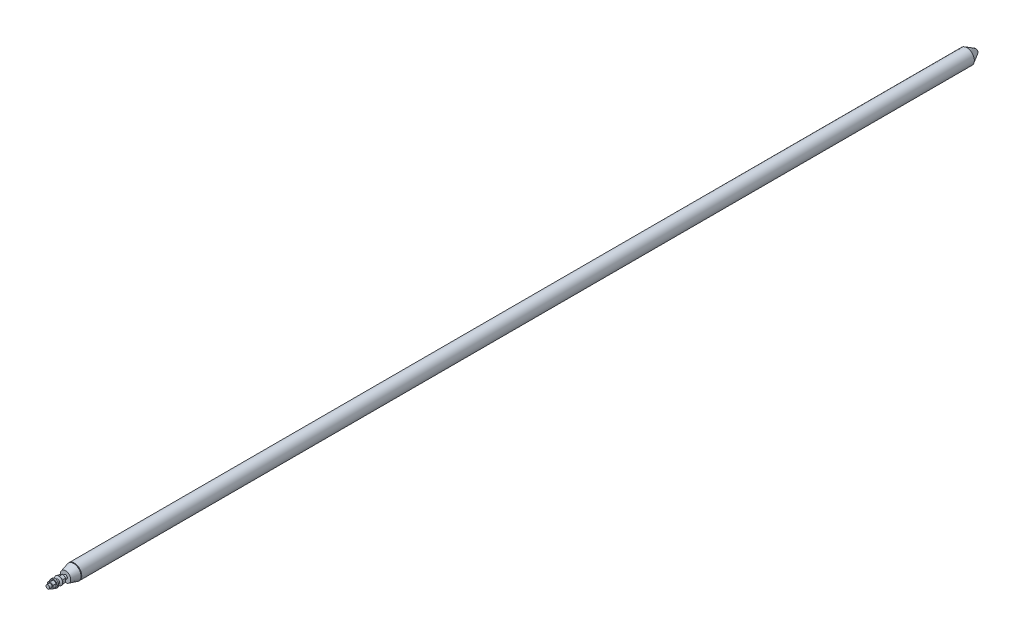
ISO-10303-21;
HEADER;
FILE_DESCRIPTION(('STEP AP214'),'2;1');
FILE_NAME('part.step','',(''),(''),'','','');
FILE_SCHEMA(('AUTOMOTIVE_DESIGN { 1 0 10303 214 1 1 1 1 }'));
ENDSEC;
DATA;
#1=APPLICATION_CONTEXT('core data for automotive mechanical design processes');
#2=APPLICATION_PROTOCOL_DEFINITION('international standard','automotive_design',2000,#1);
#3=PRODUCT_CONTEXT('',#1,'mechanical');
#4=PRODUCT('Part','Part','',(#3));
#5=PRODUCT_RELATED_PRODUCT_CATEGORY('part','',(#4));
#6=PRODUCT_DEFINITION_FORMATION('','',#4);
#7=PRODUCT_DEFINITION_CONTEXT('part definition',#1,'design');
#8=PRODUCT_DEFINITION('design','',#6,#7);
#9=PRODUCT_DEFINITION_SHAPE('','',#8);
#10=(LENGTH_UNIT() NAMED_UNIT(*) SI_UNIT(.MILLI.,.METRE.));
#11=(NAMED_UNIT(*) PLANE_ANGLE_UNIT() SI_UNIT($,.RADIAN.));
#12=(NAMED_UNIT(*) SI_UNIT($,.STERADIAN.) SOLID_ANGLE_UNIT());
#13=UNCERTAINTY_MEASURE_WITH_UNIT(LENGTH_MEASURE(1.E-05),#10,'distance_accuracy_value','');
#14=(GEOMETRIC_REPRESENTATION_CONTEXT(3) GLOBAL_UNCERTAINTY_ASSIGNED_CONTEXT((#13)) GLOBAL_UNIT_ASSIGNED_CONTEXT((#10,
#11,#12)) REPRESENTATION_CONTEXT('',''));
#15=CARTESIAN_POINT('',(0.,0.,0.));
#16=DIRECTION('',(0.,0.,1.));
#17=DIRECTION('',(1.,0.,0.));
#18=AXIS2_PLACEMENT_3D('',#15,#16,#17);
#19=CARTESIAN_POINT('',(0.,16.6751,52.1089983991226));
#20=DIRECTION('',(0.,0.,1.));
#21=DIRECTION('',(1.,0.,0.));
#22=AXIS2_PLACEMENT_3D('',#19,#20,#21);
#23=PLANE('',#22);
#24=CARTESIAN_POINT('',(0.,0.,52.1089983991226));
#25=DIRECTION('',(0.,0.,-1.));
#26=DIRECTION('',(-1.,0.,0.));
#27=AXIS2_PLACEMENT_3D('',#24,#25,#26);
#28=CIRCLE('',#27,16.6751);
#29=CARTESIAN_POINT('',(-16.6751,0.,52.1089983991226));
#30=VERTEX_POINT('',#29);
#31=EDGE_CURVE('E149',#30,#30,#28,.T.);
#32=ORIENTED_EDGE('',*,*,#31,.F.);
#33=EDGE_LOOP('',(#32));
#34=FACE_BOUND('',#33,.T.);
#35=DIRECTION('',(0.866025403784438,0.5,0.));
#36=VECTOR('',#35,1.);
#37=CARTESIAN_POINT('',(0.,-13.7554856334967,52.1089983991226));
#38=LINE('',#37,#36);
#39=CARTESIAN_POINT('',(0.,-13.7554856334967,52.1089983991226));
#40=VERTEX_POINT('',#39);
#41=CARTESIAN_POINT('',(11.9126,-6.87774281674833,52.1089983991226));
#42=VERTEX_POINT('',#41);
#43=EDGE_CURVE('E626',#40,#42,#38,.T.);
#44=ORIENTED_EDGE('',*,*,#43,.F.);
#45=DIRECTION('',(0.866025403784439,-0.499999999999999,0.));
#46=VECTOR('',#45,1.);
#47=CARTESIAN_POINT('',(-11.9126,-6.87774281674834,52.1089983991226));
#48=LINE('',#47,#46);
#49=CARTESIAN_POINT('',(-11.9126,-6.87774281674834,52.1089983991226));
#50=VERTEX_POINT('',#49);
#51=EDGE_CURVE('E147',#50,#40,#48,.T.);
#52=ORIENTED_EDGE('',*,*,#51,.F.);
#53=DIRECTION('',(0.,-1.,0.));
#54=VECTOR('',#53,1.);
#55=CARTESIAN_POINT('',(-11.9126,6.87774281674833,52.1089983991226));
#56=LINE('',#55,#54);
#57=CARTESIAN_POINT('',(-11.9126,6.87774281674833,52.1089983991226));
#58=VERTEX_POINT('',#57);
#59=EDGE_CURVE('E143',#58,#50,#56,.T.);
#60=ORIENTED_EDGE('',*,*,#59,.F.);
#61=DIRECTION('',(-0.866025403784439,-0.5,0.));
#62=VECTOR('',#61,1.);
#63=CARTESIAN_POINT('',(0.,13.7554856334967,52.1089983991226));
#64=LINE('',#63,#62);
#65=CARTESIAN_POINT('',(0.,13.7554856334967,52.1089983991226));
#66=VERTEX_POINT('',#65);
#67=EDGE_CURVE('E622',#66,#58,#64,.T.);
#68=ORIENTED_EDGE('',*,*,#67,.F.);
#69=DIRECTION('',(-0.866025403784439,0.5,0.));
#70=VECTOR('',#69,1.);
#71=CARTESIAN_POINT('',(11.9126,6.87774281674833,52.1089983991226));
#72=LINE('',#71,#70);
#73=CARTESIAN_POINT('',(11.9126,6.87774281674833,52.1089983991226));
#74=VERTEX_POINT('',#73);
#75=EDGE_CURVE('E634',#74,#66,#72,.T.);
#76=ORIENTED_EDGE('',*,*,#75,.F.);
#77=DIRECTION('',(0.,1.,0.));
#78=VECTOR('',#77,1.);
#79=CARTESIAN_POINT('',(11.9126,-6.87774281674833,52.1089983991226));
#80=LINE('',#79,#78);
#81=EDGE_CURVE('E628',#42,#74,#80,.T.);
#82=ORIENTED_EDGE('',*,*,#81,.F.);
#83=EDGE_LOOP('',(#44,#52,#60,#68,#76,#82));
#84=FACE_BOUND('',#83,.T.);
#85=ADVANCED_FACE('F33',(#34,#84),#23,.T.);
#86=CARTESIAN_POINT('',(0.,0.,0.));
#87=DIRECTION('',(0.,0.,-1.));
#88=DIRECTION('',(-1.,0.,0.));
#89=AXIS2_PLACEMENT_3D('',#86,#87,#88);
#90=CYLINDRICAL_SURFACE('',#89,7.93749999999999);
#91=CARTESIAN_POINT('',(0.,0.,46.2923983991226));
#92=DIRECTION('',(0.,0.,-1.));
#93=DIRECTION('',(-1.,0.,0.));
#94=AXIS2_PLACEMENT_3D('',#91,#92,#93);
#95=CIRCLE('',#94,7.93749999999999);
#96=CARTESIAN_POINT('',(-7.93749999999999,0.,46.2923983991226));
#97=VERTEX_POINT('',#96);
#98=EDGE_CURVE('E42',#97,#97,#95,.F.);
#99=ORIENTED_EDGE('',*,*,#98,.F.);
#100=EDGE_LOOP('',(#99));
#101=FACE_BOUND('',#100,.T.);
#102=CARTESIAN_POINT('',(0.,0.,33.5923983991226));
#103=DIRECTION('',(0.,0.,-1.));
#104=DIRECTION('',(-1.,0.,0.));
#105=AXIS2_PLACEMENT_3D('',#102,#103,#104);
#106=CIRCLE('',#105,7.93749999999999);
#107=CARTESIAN_POINT('',(0.,7.93749999999996,33.5923983991227));
#108=VERTEX_POINT('',#107);
#109=EDGE_CURVE('E236',#108,#108,#106,.T.);
#110=ORIENTED_EDGE('',*,*,#109,.F.);
#111=EDGE_LOOP('',(#110));
#112=FACE_BOUND('',#111,.T.);
#113=ADVANCED_FACE('F248',(#101,#112),#90,.T.);
#114=CARTESIAN_POINT('',(0.,0.,0.));
#115=DIRECTION('',(0.,0.,-1.));
#116=DIRECTION('',(-1.,0.,0.));
#117=AXIS2_PLACEMENT_3D('',#114,#115,#116);
#118=CIRCLE('',#117,7.93749999999999);
#119=CARTESIAN_POINT('',(-7.93749999999999,0.,0.));
#120=VERTEX_POINT('',#119);
#121=EDGE_CURVE('E224',#120,#120,#118,.T.);
#122=ORIENTED_EDGE('',*,*,#121,.F.);
#123=EDGE_LOOP('',(#122));
#124=FACE_BOUND('',#123,.T.);
#125=CARTESIAN_POINT('',(0.,0.,12.690475));
#126=DIRECTION('',(0.,0.,1.));
#127=DIRECTION('',(1.,0.,0.));
#128=AXIS2_PLACEMENT_3D('',#125,#126,#127);
#129=CIRCLE('',#128,7.93749999999999);
#130=CARTESIAN_POINT('',(7.93749999999999,0.,12.690475));
#131=VERTEX_POINT('',#130);
#132=EDGE_CURVE('E201',#131,#131,#129,.F.);
#133=ORIENTED_EDGE('',*,*,#132,.T.);
#134=EDGE_LOOP('',(#133));
#135=FACE_BOUND('',#134,.T.);
#136=ADVANCED_FACE('F251',(#124,#135),#90,.T.);
#137=CARTESIAN_POINT('',(0.,0.,-38.1));
#138=DIRECTION('',(0.,0.,1.));
#139=DIRECTION('',(1.,0.,0.));
#140=AXIS2_PLACEMENT_3D('',#137,#138,#139);
#141=CONICAL_SURFACE('',#140,28.575,0.780728808749583);
#142=CARTESIAN_POINT('',(0.,0.,-34.8952102827305));
#143=DIRECTION('',(0.,0.,-1.));
#144=DIRECTION('',(-1.,0.,0.));
#145=AXIS2_PLACEMENT_3D('',#142,#143,#144);
#146=CIRCLE('',#145,31.75);
#147=CARTESIAN_POINT('',(-31.75,0.,-34.8952102827305));
#148=VERTEX_POINT('',#147);
#149=EDGE_CURVE('E230',#148,#148,#146,.T.);
#150=ORIENTED_EDGE('',*,*,#149,.T.);
#151=EDGE_LOOP('',(#150));
#152=FACE_BOUND('',#151,.T.);
#153=CARTESIAN_POINT('',(0.,0.,-38.1));
#154=DIRECTION('',(0.,0.,-1.));
#155=DIRECTION('',(-1.,0.,0.));
#156=AXIS2_PLACEMENT_3D('',#153,#154,#155);
#157=CIRCLE('',#156,28.575);
#158=CARTESIAN_POINT('',(-28.575,0.,-38.1));
#159=VERTEX_POINT('',#158);
#160=EDGE_CURVE('E233',#159,#159,#157,.T.);
#161=ORIENTED_EDGE('',*,*,#160,.F.);
#162=EDGE_LOOP('',(#161));
#163=FACE_BOUND('',#162,.T.);
#164=ADVANCED_FACE('F454',(#152,#163),#141,.T.);
#165=CARTESIAN_POINT('',(0.,0.,-34.8952102827305));
#166=DIRECTION('',(0.,0.,-1.));
#167=DIRECTION('',(-1.,0.,0.));
#168=AXIS2_PLACEMENT_3D('',#165,#166,#167);
#169=CONICAL_SURFACE('',#168,31.75,0.266468742447018);
#170=CARTESIAN_POINT('',(0.,0.,0.));
#171=DIRECTION('',(0.,0.,-1.));
#172=DIRECTION('',(-1.,0.,0.));
#173=AXIS2_PLACEMENT_3D('',#170,#171,#172);
#174=CIRCLE('',#173,22.225);
#175=CARTESIAN_POINT('',(-22.225,0.,0.));
#176=VERTEX_POINT('',#175);
#177=EDGE_CURVE('E227',#176,#176,#174,.T.);
#178=ORIENTED_EDGE('',*,*,#177,.T.);
#179=EDGE_LOOP('',(#178));
#180=FACE_BOUND('',#179,.T.);
#181=ORIENTED_EDGE('',*,*,#149,.F.);
#182=EDGE_LOOP('',(#181));
#183=FACE_BOUND('',#182,.T.);
#184=ADVANCED_FACE('F540',(#180,#183),#169,.T.);
#185=CARTESIAN_POINT('',(0.,7.93749999999999,0.));
#186=DIRECTION('',(0.,0.,1.));
#187=DIRECTION('',(1.,0.,0.));
#188=AXIS2_PLACEMENT_3D('',#185,#186,#187);
#189=PLANE('',#188);
#190=ORIENTED_EDGE('',*,*,#121,.T.);
#191=EDGE_LOOP('',(#190));
#192=FACE_BOUND('',#191,.T.);
#193=ORIENTED_EDGE('',*,*,#177,.F.);
#194=EDGE_LOOP('',(#193));
#195=FACE_BOUND('',#194,.T.);
#196=ADVANCED_FACE('F527',(#192,#195),#189,.T.);
#197=CARTESIAN_POINT('',(0.,31.75,-38.1));
#198=DIRECTION('',(0.,0.,-1.));
#199=DIRECTION('',(-1.,0.,0.));
#200=AXIS2_PLACEMENT_3D('',#197,#198,#199);
#201=PLANE('',#200);
#202=ORIENTED_EDGE('',*,*,#160,.T.);
#203=EDGE_LOOP('',(#202));
#204=FACE_BOUND('',#203,.T.);
#205=CARTESIAN_POINT('',(0.,0.,-38.1));
#206=DIRECTION('',(0.,0.,1.));
#207=DIRECTION('',(1.,0.,0.));
#208=AXIS2_PLACEMENT_3D('',#205,#206,#207);
#209=CIRCLE('',#208,31.75);
#210=CARTESIAN_POINT('',(31.75,0.,-38.1));
#211=VERTEX_POINT('',#210);
#212=EDGE_CURVE('E205',#211,#211,#209,.T.);
#213=ORIENTED_EDGE('',*,*,#212,.T.);
#214=EDGE_LOOP('',(#213));
#215=FACE_BOUND('',#214,.T.);
#216=ADVANCED_FACE('F523',(#204,#215),#201,.F.);
#217=CARTESIAN_POINT('',(0.,0.,29.7434));
#218=DIRECTION('',(0.,0.,1.));
#219=DIRECTION('',(1.,0.,0.));
#220=AXIS2_PLACEMENT_3D('',#217,#218,#219);
#221=CYLINDRICAL_SURFACE('',#220,31.75);
#222=ORIENTED_EDGE('',*,*,#212,.F.);
#223=EDGE_LOOP('',(#222));
#224=FACE_BOUND('',#223,.T.);
#225=CARTESIAN_POINT('',(0.,0.,-3880.04092995474));
#226=DIRECTION('',(0.,0.,1.));
#227=DIRECTION('',(1.,0.,0.));
#228=AXIS2_PLACEMENT_3D('',#225,#226,#227);
#229=CIRCLE('',#228,31.75);
#230=CARTESIAN_POINT('',(31.75,0.,-3880.04092995474));
#231=VERTEX_POINT('',#230);
#232=EDGE_CURVE('E208',#231,#231,#229,.T.);
#233=ORIENTED_EDGE('',*,*,#232,.T.);
#234=EDGE_LOOP('',(#233));
#235=FACE_BOUND('',#234,.T.);
#236=ADVANCED_FACE('F526',(#224,#235),#221,.T.);
#237=CARTESIAN_POINT('',(0.,0.,-3915.98354309505));
#238=DIRECTION('',(0.,0.,1.));
#239=DIRECTION('',(1.,0.,0.));
#240=AXIS2_PLACEMENT_3D('',#237,#238,#239);
#241=CONICAL_SURFACE('',#240,10.9985226280624,0.523598775598299);
#242=ORIENTED_EDGE('',*,*,#232,.F.);
#243=EDGE_LOOP('',(#242));
#244=FACE_BOUND('',#243,.T.);
#245=CARTESIAN_POINT('',(0.,0.,-3915.98354309505));
#246=DIRECTION('',(0.,0.,1.));
#247=DIRECTION('',(1.,0.,0.));
#248=AXIS2_PLACEMENT_3D('',#245,#246,#247);
#249=CIRCLE('',#248,10.9985226280624);
#250=CARTESIAN_POINT('',(10.9985226280624,0.,-3915.98354309505));
#251=VERTEX_POINT('',#250);
#252=EDGE_CURVE('E211',#251,#251,#249,.T.);
#253=ORIENTED_EDGE('',*,*,#252,.T.);
#254=EDGE_LOOP('',(#253));
#255=FACE_BOUND('',#254,.T.);
#256=ADVANCED_FACE('F531',(#244,#255),#241,.T.);
#257=CARTESIAN_POINT('',(0.,0.,-3909.63354309505));
#258=DIRECTION('',(0.,0.,1.));
#259=DIRECTION('',(0.,1.,0.));
#260=AXIS2_PLACEMENT_3D('',#257,#258,#259);
#261=SPHERICAL_SURFACE('',#260,12.7000000000001);
#262=ORIENTED_EDGE('',*,*,#252,.F.);
#263=EDGE_LOOP('',(#262));
#264=FACE_BOUND('',#263,.T.);
#265=ADVANCED_FACE('F464',(#264),#261,.T.);
#266=CARTESIAN_POINT('',(13.5001,-7.79428636908687,12.690475));
#267=DIRECTION('',(-0.499999999999999,0.866025403784439,0.));
#268=DIRECTION('',(-0.866025403784439,-0.5,0.));
#269=AXIS2_PLACEMENT_3D('',#266,#267,#268);
#270=PLANE('',#269);
#271=DIRECTION('',(-0.866025403784439,-0.499999999999999,0.));
#272=VECTOR('',#271,1.);
#273=CARTESIAN_POINT('',(13.5001,-7.79428636908687,28.1686));
#274=LINE('',#273,#272);
#275=CARTESIAN_POINT('',(13.5001,-7.79428636908687,28.1686));
#276=VERTEX_POINT('',#275);
#277=CARTESIAN_POINT('',(0.,-15.5885727381737,28.1686));
#278=VERTEX_POINT('',#277);
#279=EDGE_CURVE('E160',#276,#278,#274,.T.);
#280=ORIENTED_EDGE('',*,*,#279,.T.);
#281=DIRECTION('',(0.,0.,1.));
#282=VECTOR('',#281,1.);
#283=CARTESIAN_POINT('',(0.,-15.5885727381737,12.690475));
#284=LINE('',#283,#282);
#285=CARTESIAN_POINT('',(0.,-15.5885727381737,12.690475));
#286=VERTEX_POINT('',#285);
#287=EDGE_CURVE('E199',#286,#278,#284,.T.);
#288=ORIENTED_EDGE('',*,*,#287,.F.);
#289=DIRECTION('',(-0.866025403784439,-0.499999999999999,0.));
#290=VECTOR('',#289,1.);
#291=CARTESIAN_POINT('',(13.5001,-7.79428636908687,12.690475));
#292=LINE('',#291,#290);
#293=CARTESIAN_POINT('',(13.5001,-7.79428636908687,12.690475));
#294=VERTEX_POINT('',#293);
#295=EDGE_CURVE('E161',#294,#286,#292,.T.);
#296=ORIENTED_EDGE('',*,*,#295,.F.);
#297=DIRECTION('',(0.,0.,1.));
#298=VECTOR('',#297,1.);
#299=CARTESIAN_POINT('',(13.5001,-7.79428636908687,12.690475));
#300=LINE('',#299,#298);
#301=EDGE_CURVE('E175',#294,#276,#300,.T.);
#302=ORIENTED_EDGE('',*,*,#301,.T.);
#303=EDGE_LOOP('',(#280,#288,#296,#302));
#304=FACE_BOUND('',#303,.T.);
#305=ADVANCED_FACE('F292',(#304),#270,.F.);
#306=CARTESIAN_POINT('',(0.,-15.5885727381737,12.690475));
#307=DIRECTION('',(0.5,0.866025403784438,0.));
#308=DIRECTION('',(-0.866025403784438,0.5,0.));
#309=AXIS2_PLACEMENT_3D('',#306,#307,#308);
#310=PLANE('',#309);
#311=DIRECTION('',(-0.866025403784438,0.5,0.));
#312=VECTOR('',#311,1.);
#313=CARTESIAN_POINT('',(0.,-15.5885727381737,28.1686));
#314=LINE('',#313,#312);
#315=CARTESIAN_POINT('',(-13.5001,-7.79428636908686,28.1686));
#316=VERTEX_POINT('',#315);
#317=EDGE_CURVE('E178',#278,#316,#314,.T.);
#318=ORIENTED_EDGE('',*,*,#317,.T.);
#319=DIRECTION('',(0.,0.,1.));
#320=VECTOR('',#319,1.);
#321=CARTESIAN_POINT('',(-13.5001,-7.79428636908686,12.690475));
#322=LINE('',#321,#320);
#323=CARTESIAN_POINT('',(-13.5001,-7.79428636908686,12.690475));
#324=VERTEX_POINT('',#323);
#325=EDGE_CURVE('E196',#324,#316,#322,.T.);
#326=ORIENTED_EDGE('',*,*,#325,.F.);
#327=DIRECTION('',(-0.866025403784438,0.5,0.));
#328=VECTOR('',#327,1.);
#329=CARTESIAN_POINT('',(0.,-15.5885727381737,12.690475));
#330=LINE('',#329,#328);
#331=EDGE_CURVE('E164',#286,#324,#330,.T.);
#332=ORIENTED_EDGE('',*,*,#331,.F.);
#333=ORIENTED_EDGE('',*,*,#287,.T.);
#334=EDGE_LOOP('',(#318,#326,#332,#333));
#335=FACE_BOUND('',#334,.T.);
#336=ADVANCED_FACE('F280',(#335),#310,.F.);
#337=CARTESIAN_POINT('',(-13.5001,-7.79428636908686,12.690475));
#338=DIRECTION('',(1.,0.,0.));
#339=DIRECTION('',(0.,1.,0.));
#340=AXIS2_PLACEMENT_3D('',#337,#338,#339);
#341=PLANE('',#340);
#342=DIRECTION('',(0.,1.,0.));
#343=VECTOR('',#342,1.);
#344=CARTESIAN_POINT('',(-13.5001,-7.79428636908686,28.1686));
#345=LINE('',#344,#343);
#346=CARTESIAN_POINT('',(-13.5001,7.79428636908686,28.1686));
#347=VERTEX_POINT('',#346);
#348=EDGE_CURVE('E180',#316,#347,#345,.T.);
#349=ORIENTED_EDGE('',*,*,#348,.T.);
#350=DIRECTION('',(0.,0.,1.));
#351=VECTOR('',#350,1.);
#352=CARTESIAN_POINT('',(-13.5001,7.79428636908686,12.690475));
#353=LINE('',#352,#351);
#354=CARTESIAN_POINT('',(-13.5001,7.79428636908686,12.690475));
#355=VERTEX_POINT('',#354);
#356=EDGE_CURVE('E193',#355,#347,#353,.T.);
#357=ORIENTED_EDGE('',*,*,#356,.F.);
#358=DIRECTION('',(0.,1.,0.));
#359=VECTOR('',#358,1.);
#360=CARTESIAN_POINT('',(-13.5001,-7.79428636908686,12.690475));
#361=LINE('',#360,#359);
#362=EDGE_CURVE('E167',#324,#355,#361,.T.);
#363=ORIENTED_EDGE('',*,*,#362,.F.);
#364=ORIENTED_EDGE('',*,*,#325,.T.);
#365=EDGE_LOOP('',(#349,#357,#363,#364));
#366=FACE_BOUND('',#365,.T.);
#367=ADVANCED_FACE('F284',(#366),#341,.F.);
#368=CARTESIAN_POINT('',(-13.5001,7.79428636908686,12.690475));
#369=DIRECTION('',(0.5,-0.866025403784439,0.));
#370=DIRECTION('',(0.866025403784439,0.5,0.));
#371=AXIS2_PLACEMENT_3D('',#368,#369,#370);
#372=PLANE('',#371);
#373=DIRECTION('',(0.866025403784439,0.5,0.));
#374=VECTOR('',#373,1.);
#375=CARTESIAN_POINT('',(-13.5001,7.79428636908686,28.1686));
#376=LINE('',#375,#374);
#377=CARTESIAN_POINT('',(0.,15.5885727381737,28.1686));
#378=VERTEX_POINT('',#377);
#379=EDGE_CURVE('E182',#347,#378,#376,.T.);
#380=ORIENTED_EDGE('',*,*,#379,.T.);
#381=DIRECTION('',(0.,0.,1.));
#382=VECTOR('',#381,1.);
#383=CARTESIAN_POINT('',(0.,15.5885727381737,12.690475));
#384=LINE('',#383,#382);
#385=CARTESIAN_POINT('',(0.,15.5885727381737,12.690475));
#386=VERTEX_POINT('',#385);
#387=EDGE_CURVE('E190',#386,#378,#384,.T.);
#388=ORIENTED_EDGE('',*,*,#387,.F.);
#389=DIRECTION('',(0.866025403784439,0.5,0.));
#390=VECTOR('',#389,1.);
#391=CARTESIAN_POINT('',(-13.5001,7.79428636908686,12.690475));
#392=LINE('',#391,#390);
#393=EDGE_CURVE('E169',#355,#386,#392,.T.);
#394=ORIENTED_EDGE('',*,*,#393,.F.);
#395=ORIENTED_EDGE('',*,*,#356,.T.);
#396=EDGE_LOOP('',(#380,#388,#394,#395));
#397=FACE_BOUND('',#396,.T.);
#398=ADVANCED_FACE('F299',(#397),#372,.F.);
#399=CARTESIAN_POINT('',(0.,15.5885727381737,12.690475));
#400=DIRECTION('',(-0.5,-0.866025403784438,0.));
#401=DIRECTION('',(0.866025403784439,-0.5,0.));
#402=AXIS2_PLACEMENT_3D('',#399,#400,#401);
#403=PLANE('',#402);
#404=DIRECTION('',(0.866025403784438,-0.5,0.));
#405=VECTOR('',#404,1.);
#406=CARTESIAN_POINT('',(0.,15.5885727381737,28.1686));
#407=LINE('',#406,#405);
#408=CARTESIAN_POINT('',(13.5001,7.79428636908686,28.1686));
#409=VERTEX_POINT('',#408);
#410=EDGE_CURVE('E184',#378,#409,#407,.T.);
#411=ORIENTED_EDGE('',*,*,#410,.T.);
#412=DIRECTION('',(0.,0.,1.));
#413=VECTOR('',#412,1.);
#414=CARTESIAN_POINT('',(13.5001,7.79428636908686,12.690475));
#415=LINE('',#414,#413);
#416=CARTESIAN_POINT('',(13.5001,7.79428636908686,12.690475));
#417=VERTEX_POINT('',#416);
#418=EDGE_CURVE('E57',#417,#409,#415,.T.);
#419=ORIENTED_EDGE('',*,*,#418,.F.);
#420=DIRECTION('',(0.866025403784438,-0.5,0.));
#421=VECTOR('',#420,1.);
#422=CARTESIAN_POINT('',(0.,15.5885727381737,12.690475));
#423=LINE('',#422,#421);
#424=EDGE_CURVE('E171',#386,#417,#423,.T.);
#425=ORIENTED_EDGE('',*,*,#424,.F.);
#426=ORIENTED_EDGE('',*,*,#387,.T.);
#427=EDGE_LOOP('',(#411,#419,#425,#426));
#428=FACE_BOUND('',#427,.T.);
#429=ADVANCED_FACE('F296',(#428),#403,.F.);
#430=CARTESIAN_POINT('',(13.5001,7.79428636908686,12.690475));
#431=DIRECTION('',(-1.,0.,0.));
#432=DIRECTION('',(0.,0.,1.));
#433=AXIS2_PLACEMENT_3D('',#430,#431,#432);
#434=PLANE('',#433);
#435=DIRECTION('',(0.,-1.,0.));
#436=VECTOR('',#435,1.);
#437=CARTESIAN_POINT('',(13.5001,7.79428636908686,28.1686));
#438=LINE('',#437,#436);
#439=EDGE_CURVE('E165',#409,#276,#438,.T.);
#440=ORIENTED_EDGE('',*,*,#439,.T.);
#441=ORIENTED_EDGE('',*,*,#301,.F.);
#442=DIRECTION('',(0.,-1.,0.));
#443=VECTOR('',#442,1.);
#444=CARTESIAN_POINT('',(13.5001,7.79428636908686,12.690475));
#445=LINE('',#444,#443);
#446=EDGE_CURVE('E173',#417,#294,#445,.T.);
#447=ORIENTED_EDGE('',*,*,#446,.F.);
#448=ORIENTED_EDGE('',*,*,#418,.T.);
#449=EDGE_LOOP('',(#440,#441,#447,#448));
#450=FACE_BOUND('',#449,.T.);
#451=ADVANCED_FACE('F293',(#450),#434,.F.);
#452=CARTESIAN_POINT('',(13.5001,-7.79428636908687,12.690475));
#453=DIRECTION('',(0.,0.,1.));
#454=DIRECTION('',(1.,0.,0.));
#455=AXIS2_PLACEMENT_3D('',#452,#453,#454);
#456=PLANE('',#455);
#457=ORIENTED_EDGE('',*,*,#132,.F.);
#458=EDGE_LOOP('',(#457));
#459=FACE_BOUND('',#458,.T.);
#460=ORIENTED_EDGE('',*,*,#295,.T.);
#461=ORIENTED_EDGE('',*,*,#331,.T.);
#462=ORIENTED_EDGE('',*,*,#362,.T.);
#463=ORIENTED_EDGE('',*,*,#393,.T.);
#464=ORIENTED_EDGE('',*,*,#424,.T.);
#465=ORIENTED_EDGE('',*,*,#446,.T.);
#466=EDGE_LOOP('',(#460,#461,#462,#463,#464,#465));
#467=FACE_BOUND('',#466,.T.);
#468=ADVANCED_FACE('F260',(#459,#467),#456,.F.);
#469=CARTESIAN_POINT('',(0.,0.,0.0435161764705885));
#470=DIRECTION('',(0.,0.,-1.));
#471=DIRECTION('',(0.,1.,0.));
#472=AXIS2_PLACEMENT_3D('',#469,#470,#471);
#473=SPHERICAL_SURFACE('',#472,34.4750838235294);
#474=CARTESIAN_POINT('',(0.,0.,29.7688));
#475=DIRECTION('',(0.,0.,-1.));
#476=DIRECTION('',(-1.,0.,0.));
#477=AXIS2_PLACEMENT_3D('',#474,#475,#476);
#478=CIRCLE('',#477,17.4625);
#479=CARTESIAN_POINT('',(0.,17.4625,29.7688));
#480=VERTEX_POINT('',#479);
#481=EDGE_CURVE('E215',#480,#480,#478,.T.);
#482=CARTESIAN_POINT('',(0.,7.93749999999996,33.5923983991227));
#483=CARTESIAN_POINT('',(0.,8.04193033230631,33.5676907138939));
#484=CARTESIAN_POINT('',(0.,8.14624529277318,33.5424953955937));
#485=CARTESIAN_POINT('',(0.,8.35463538983752,33.4911317569022));
#486=CARTESIAN_POINT('',(0.,8.458710526435,33.464963436511));
#487=CARTESIAN_POINT('',(0.,8.66661189557016,33.4116560576896));
#488=CARTESIAN_POINT('',(0.,8.77043812810784,33.3845169992594));
#489=CARTESIAN_POINT('',(0.,8.97783263624223,33.3292705157999));
#490=CARTESIAN_POINT('',(0.,9.08140091183892,33.3011630907704));
#491=CARTESIAN_POINT('',(0.,9.28827047420351,33.2439823239056));
#492=CARTESIAN_POINT('',(0.,9.39157176097139,33.2149089820701));
#493=CARTESIAN_POINT('',(0.,9.59789833747534,33.1557989172506));
#494=CARTESIAN_POINT('',(0.,9.7009236272114,33.1257621942665));
#495=CARTESIAN_POINT('',(0.,9.90668922540895,33.0647279863804));
#496=CARTESIAN_POINT('',(0.,10.0094295338704,33.0337305014784));
#497=CARTESIAN_POINT('',(0.,10.2146162101565,32.9707774728867));
#498=CARTESIAN_POINT('',(0.,10.3170625779811,32.938821929197));
#499=CARTESIAN_POINT('',(0.,10.521652439256,32.8739555696753));
#500=CARTESIAN_POINT('',(0.,10.6237959327063,32.8410447538433));
#501=CARTESIAN_POINT('',(0.,10.8277711379095,32.7742707199945));
#502=CARTESIAN_POINT('',(0.,10.9296028496623,32.7404075019776));
#503=CARTESIAN_POINT('',(0.,11.132945611335,32.6717316167674));
#504=CARTESIAN_POINT('',(0.,11.234456661255,32.636918949574));
#505=CARTESIAN_POINT('',(0.,11.4371492470899,32.5663472018157));
#506=CARTESIAN_POINT('',(0.,11.5383307830049,32.5305881212508));
#507=CARTESIAN_POINT('',(0.,11.7403555173927,32.458126665085));
#508=CARTESIAN_POINT('',(0.,11.8411987158655,32.4214242894841));
#509=CARTESIAN_POINT('',(0.,12.042537981436,32.3470794438415));
#510=CARTESIAN_POINT('',(0.,12.1430340485337,32.3094369737997));
#511=CARTESIAN_POINT('',(0.,12.3436702876927,32.2332152218499));
#512=CARTESIAN_POINT('',(0.,12.4438104597538,32.194635939942));
#513=CARTESIAN_POINT('',(0.,12.6437261762134,32.1165439285288));
#514=CARTESIAN_POINT('',(0.,12.7435017206118,32.0770311990235));
#515=CARTESIAN_POINT('',(0.,12.9426794809169,31.9970757380846));
#516=CARTESIAN_POINT('',(0.,13.0420816968236,31.956633006651));
#517=CARTESIAN_POINT('',(0.,13.2405041318717,31.8748210686243));
#518=CARTESIAN_POINT('',(0.,13.3395243510132,31.8334518620313));
#519=CARTESIAN_POINT('',(0.,13.5371741575694,31.7497905812473));
#520=CARTESIAN_POINT('',(0.,13.6358037449841,31.7074985070563));
#521=CARTESIAN_POINT('',(0.,13.8326636871895,31.6219951791153));
#522=CARTESIAN_POINT('',(0.,13.9308940419803,31.5787839253653));
#523=CARTESIAN_POINT('',(0.,14.1269469528556,31.4914460065018));
#524=CARTESIAN_POINT('',(0.,14.2247695089402,31.4473193413882));
#525=CARTESIAN_POINT('',(0.,14.4199982918825,31.3581544478201));
#526=CARTESIAN_POINT('',(0.,14.5174045187402,31.3131162193657));
#527=CARTESIAN_POINT('',(0.,14.7117921490136,31.2221321266308));
#528=CARTESIAN_POINT('',(0.,14.8087735524293,31.1761862623503));
#529=CARTESIAN_POINT('',(0.,15.0023030786502,31.0833909046278));
#530=CARTESIAN_POINT('',(0.,15.0988512014553,31.0365414111859));
#531=CARTESIAN_POINT('',(0.,15.2915057470694,30.9419428806036));
#532=CARTESIAN_POINT('',(0.,15.3876121698782,30.8941938434631));
#533=CARTESIAN_POINT('',(0.,15.579374934636,30.7978003893978));
#534=CARTESIAN_POINT('',(0.,15.675031276585,30.749155972473));
#535=CARTESIAN_POINT('',(0.,15.8658855379922,30.6509760008058));
#536=CARTESIAN_POINT('',(0.,15.9610834574505,30.6014404460634));
#537=CARTESIAN_POINT('',(0.,16.1510125722821,30.5014825185434));
#538=CARTESIAN_POINT('',(0.,16.2457437676554,30.4510601457658));
#539=CARTESIAN_POINT('',(0.,16.4347311731984,30.3493329789012));
#540=CARTESIAN_POINT('',(0.,16.5289873833681,30.2980281848143));
#541=CARTESIAN_POINT('',(0.,16.7170165996438,30.194540650465));
#542=CARTESIAN_POINT('',(0.,16.8107896057498,30.1423579102026));
#543=CARTESIAN_POINT('',(0.,16.9978442340481,30.0371190297578));
#544=CARTESIAN_POINT('',(0.,17.0911258562404,29.9840628895754));
#545=CARTESIAN_POINT('',(0.,17.2771895913833,29.877081852009));
#546=CARTESIAN_POINT('',(0.,17.369971704334,29.8231569546252));
#547=CARTESIAN_POINT('',(0.,17.4625,29.7688));
#548=B_SPLINE_CURVE_WITH_KNOTS('',3,(#482,#483,#484,#485,#486,#487,#488,#489,#490,#491,#492,
#493,#494,#495,#496,#497,#498,#499,#500,#501,#502,#503,#504,#505,#506,#507,#508,#509,#510,#511,
#512,#513,#514,#515,#516,#517,#518,#519,#520,#521,#522,#523,#524,#525,#526,#527,#528,#529,#530,
#531,#532,#533,#534,#535,#536,#537,#538,#539,#540,#541,#542,#543,#544,#545,#546,#547),
.UNSPECIFIED.,.F.,.F.,(4,2,2,2,2,2,2,2,2,2,2,2,2,2,2,2,2,2,2,2,2,2,2,2,2,2,2,2,2,2,2,2,4),(0.,
0.321939004572816,0.643878009145632,0.965817013718447,1.28775601829126,1.60969502286408,
1.9316340274369,2.25357303200971,2.57551203658253,2.89745104115534,3.21939004572815,
3.54132905030097,3.86326805487378,4.1852070594466,4.50714606401941,4.82908506859223,
5.15102407316505,5.47296307773786,5.79490208231068,6.11684108688349,6.43878009145631,
6.76071909602913,7.08265810060194,7.40459710517475,7.72653610974757,8.04847511432038,
8.3704141188932,8.69235312346602,9.01429212803883,9.33623113261165,9.65817013718446,
9.98010914175728,10.3020481463301),.UNSPECIFIED.);
#549=EDGE_CURVE('BSEAM256',#108,#480,#548,.T.);
#550=ORIENTED_EDGE('',*,*,#109,.T.);
#551=ORIENTED_EDGE('',*,*,#481,.F.);
#552=ORIENTED_EDGE('',*,*,#549,.T.);
#553=ORIENTED_EDGE('',*,*,#549,.F.);
#554=EDGE_LOOP('',(#550,#552,#551,#553));
#555=FACE_BOUND('',#554,.T.);
#556=ADVANCED_FACE('F256',(#555),#473,.T.);
#557=CARTESIAN_POINT('',(0.,0.,0.));
#558=DIRECTION('',(0.,0.,-1.));
#559=DIRECTION('',(-1.,0.,0.));
#560=AXIS2_PLACEMENT_3D('',#557,#558,#559);
#561=CYLINDRICAL_SURFACE('',#560,17.4625);
#562=ORIENTED_EDGE('',*,*,#481,.T.);
#563=EDGE_LOOP('',(#562));
#564=FACE_BOUND('',#563,.T.);
#565=CARTESIAN_POINT('',(0.,0.,28.1686));
#566=DIRECTION('',(0.,0.,-1.));
#567=DIRECTION('',(-1.,0.,0.));
#568=AXIS2_PLACEMENT_3D('',#565,#566,#567);
#569=CIRCLE('',#568,17.4625);
#570=CARTESIAN_POINT('',(-17.4625,0.,28.1686));
#571=VERTEX_POINT('',#570);
#572=EDGE_CURVE('E218',#571,#571,#569,.T.);
#573=ORIENTED_EDGE('',*,*,#572,.F.);
#574=EDGE_LOOP('',(#573));
#575=FACE_BOUND('',#574,.T.);
#576=ADVANCED_FACE('F259',(#564,#575),#561,.T.);
#577=CARTESIAN_POINT('',(0.,0.,28.1686));
#578=DIRECTION('',(0.,0.,-1.));
#579=DIRECTION('',(-1.,0.,0.));
#580=AXIS2_PLACEMENT_3D('',#577,#578,#579);
#581=PLANE('',#580);
#582=ORIENTED_EDGE('',*,*,#572,.T.);
#583=EDGE_LOOP('',(#582));
#584=FACE_BOUND('',#583,.T.);
#585=ORIENTED_EDGE('',*,*,#317,.F.);
#586=ORIENTED_EDGE('',*,*,#279,.F.);
#587=ORIENTED_EDGE('',*,*,#439,.F.);
#588=ORIENTED_EDGE('',*,*,#410,.F.);
#589=ORIENTED_EDGE('',*,*,#379,.F.);
#590=ORIENTED_EDGE('',*,*,#348,.F.);
#591=EDGE_LOOP('',(#585,#586,#587,#588,#589,#590));
#592=FACE_BOUND('',#591,.T.);
#593=ADVANCED_FACE('F266',(#584,#592),#581,.T.);
#594=CARTESIAN_POINT('',(0.,0.,46.2923983991226));
#595=DIRECTION('',(0.,0.,-1.));
#596=DIRECTION('',(-1.,0.,0.));
#597=AXIS2_PLACEMENT_3D('',#594,#595,#596);
#598=PLANE('',#597);
#599=ORIENTED_EDGE('',*,*,#98,.T.);
#600=EDGE_LOOP('',(#599));
#601=FACE_BOUND('',#600,.T.);
#602=CARTESIAN_POINT('',(0.,0.,46.2923983991226));
#603=DIRECTION('',(0.,0.,-1.));
#604=DIRECTION('',(-1.,0.,0.));
#605=AXIS2_PLACEMENT_3D('',#602,#603,#604);
#606=CIRCLE('',#605,16.6751);
#607=CARTESIAN_POINT('',(-16.6751,0.,46.2923983991226));
#608=VERTEX_POINT('',#607);
#609=EDGE_CURVE('E152',#608,#608,#606,.T.);
#610=ORIENTED_EDGE('',*,*,#609,.T.);
#611=EDGE_LOOP('',(#610));
#612=FACE_BOUND('',#611,.T.);
#613=ADVANCED_FACE('F245',(#601,#612),#598,.T.);
#614=CARTESIAN_POINT('',(0.,0.,0.));
#615=DIRECTION('',(0.,0.,-1.));
#616=DIRECTION('',(-1.,0.,0.));
#617=AXIS2_PLACEMENT_3D('',#614,#615,#616);
#618=CYLINDRICAL_SURFACE('',#617,16.6751);
#619=ORIENTED_EDGE('',*,*,#31,.T.);
#620=EDGE_LOOP('',(#619));
#621=FACE_BOUND('',#620,.T.);
#622=ORIENTED_EDGE('',*,*,#609,.F.);
#623=EDGE_LOOP('',(#622));
#624=FACE_BOUND('',#623,.T.);
#625=ADVANCED_FACE('F318',(#621,#624),#618,.T.);
#626=CARTESIAN_POINT('',(-11.9126,-6.87774281674834,65.9996233991226));
#627=DIRECTION('',(0.499999999999999,0.866025403784439,0.));
#628=DIRECTION('',(-0.866025403784439,0.499999999999999,0.));
#629=AXIS2_PLACEMENT_3D('',#626,#627,#628);
#630=PLANE('',#629);
#631=ORIENTED_EDGE('',*,*,#51,.T.);
#632=DIRECTION('',(0.,0.,-1.));
#633=VECTOR('',#632,1.);
#634=CARTESIAN_POINT('',(0.,-13.7554856334967,65.9996233991226));
#635=LINE('',#634,#633);
#636=CARTESIAN_POINT('',(0.,-13.7554856334967,65.9996233991226));
#637=VERTEX_POINT('',#636);
#638=EDGE_CURVE('E128',#637,#40,#635,.T.);
#639=ORIENTED_EDGE('',*,*,#638,.F.);
#640=DIRECTION('',(0.866025403784439,-0.499999999999999,0.));
#641=VECTOR('',#640,1.);
#642=CARTESIAN_POINT('',(-11.9126,-6.87774281674834,65.9996233991226));
#643=LINE('',#642,#641);
#644=CARTESIAN_POINT('',(-11.9126,-6.87774281674834,65.9996233991226));
#645=VERTEX_POINT('',#644);
#646=EDGE_CURVE('E135',#645,#637,#643,.T.);
#647=ORIENTED_EDGE('',*,*,#646,.F.);
#648=DIRECTION('',(0.,0.,-1.));
#649=VECTOR('',#648,1.);
#650=CARTESIAN_POINT('',(-11.9126,-6.87774281674834,65.9996233991226));
#651=LINE('',#650,#649);
#652=EDGE_CURVE('E620',#645,#50,#651,.T.);
#653=ORIENTED_EDGE('',*,*,#652,.T.);
#654=EDGE_LOOP('',(#631,#639,#647,#653));
#655=FACE_BOUND('',#654,.T.);
#656=ADVANCED_FACE('F145',(#655),#630,.F.);
#657=CARTESIAN_POINT('',(0.,-13.7554856334967,65.9996233991226));
#658=DIRECTION('',(-0.5,0.866025403784438,0.));
#659=DIRECTION('',(-0.866025403784438,-0.5,0.));
#660=AXIS2_PLACEMENT_3D('',#657,#658,#659);
#661=PLANE('',#660);
#662=ORIENTED_EDGE('',*,*,#43,.T.);
#663=DIRECTION('',(0.,0.,-1.));
#664=VECTOR('',#663,1.);
#665=CARTESIAN_POINT('',(11.9126,-6.87774281674833,65.9996233991226));
#666=LINE('',#665,#664);
#667=CARTESIAN_POINT('',(11.9126,-6.87774281674833,65.9996233991226));
#668=VERTEX_POINT('',#667);
#669=EDGE_CURVE('E131',#668,#42,#666,.T.);
#670=ORIENTED_EDGE('',*,*,#669,.F.);
#671=DIRECTION('',(0.866025403784438,0.5,0.));
#672=VECTOR('',#671,1.);
#673=CARTESIAN_POINT('',(0.,-13.7554856334967,65.9996233991226));
#674=LINE('',#673,#672);
#675=EDGE_CURVE('E124',#637,#668,#674,.T.);
#676=ORIENTED_EDGE('',*,*,#675,.F.);
#677=ORIENTED_EDGE('',*,*,#638,.T.);
#678=EDGE_LOOP('',(#662,#670,#676,#677));
#679=FACE_BOUND('',#678,.T.);
#680=ADVANCED_FACE('F126',(#679),#661,.F.);
#681=CARTESIAN_POINT('',(11.9126,-6.87774281674833,65.9996233991226));
#682=DIRECTION('',(-1.,0.,0.));
#683=DIRECTION('',(0.,-1.,0.));
#684=AXIS2_PLACEMENT_3D('',#681,#682,#683);
#685=PLANE('',#684);
#686=ORIENTED_EDGE('',*,*,#81,.T.);
#687=DIRECTION('',(0.,0.,-1.));
#688=VECTOR('',#687,1.);
#689=CARTESIAN_POINT('',(11.9126,6.87774281674833,65.9996233991226));
#690=LINE('',#689,#688);
#691=CARTESIAN_POINT('',(11.9126,6.87774281674833,65.9996233991226));
#692=VERTEX_POINT('',#691);
#693=EDGE_CURVE('E154',#692,#74,#690,.T.);
#694=ORIENTED_EDGE('',*,*,#693,.F.);
#695=DIRECTION('',(0.,1.,0.));
#696=VECTOR('',#695,1.);
#697=CARTESIAN_POINT('',(11.9126,-6.87774281674833,65.9996233991226));
#698=LINE('',#697,#696);
#699=EDGE_CURVE('E134',#668,#692,#698,.T.);
#700=ORIENTED_EDGE('',*,*,#699,.F.);
#701=ORIENTED_EDGE('',*,*,#669,.T.);
#702=EDGE_LOOP('',(#686,#694,#700,#701));
#703=FACE_BOUND('',#702,.T.);
#704=ADVANCED_FACE('F370',(#703),#685,.F.);
#705=CARTESIAN_POINT('',(11.9126,6.87774281674833,65.9996233991226));
#706=DIRECTION('',(-0.5,-0.866025403784439,0.));
#707=DIRECTION('',(0.866025403784439,-0.5,0.));
#708=AXIS2_PLACEMENT_3D('',#705,#706,#707);
#709=PLANE('',#708);
#710=ORIENTED_EDGE('',*,*,#75,.T.);
#711=DIRECTION('',(0.,0.,-1.));
#712=VECTOR('',#711,1.);
#713=CARTESIAN_POINT('',(0.,13.7554856334967,65.9996233991226));
#714=LINE('',#713,#712);
#715=CARTESIAN_POINT('',(0.,13.7554856334967,65.9996233991226));
#716=VERTEX_POINT('',#715);
#717=EDGE_CURVE('E638',#716,#66,#714,.T.);
#718=ORIENTED_EDGE('',*,*,#717,.F.);
#719=DIRECTION('',(-0.866025403784439,0.5,0.));
#720=VECTOR('',#719,1.);
#721=CARTESIAN_POINT('',(11.9126,6.87774281674833,65.9996233991226));
#722=LINE('',#721,#720);
#723=EDGE_CURVE('E645',#692,#716,#722,.T.);
#724=ORIENTED_EDGE('',*,*,#723,.F.);
#725=ORIENTED_EDGE('',*,*,#693,.T.);
#726=EDGE_LOOP('',(#710,#718,#724,#725));
#727=FACE_BOUND('',#726,.T.);
#728=ADVANCED_FACE('F376',(#727),#709,.F.);
#729=CARTESIAN_POINT('',(0.,13.7554856334967,65.9996233991226));
#730=DIRECTION('',(0.5,-0.866025403784439,0.));
#731=DIRECTION('',(0.866025403784439,0.5,0.));
#732=AXIS2_PLACEMENT_3D('',#729,#730,#731);
#733=PLANE('',#732);
#734=ORIENTED_EDGE('',*,*,#67,.T.);
#735=DIRECTION('',(0.,0.,-1.));
#736=VECTOR('',#735,1.);
#737=CARTESIAN_POINT('',(-11.9126,6.87774281674833,65.9996233991226));
#738=LINE('',#737,#736);
#739=CARTESIAN_POINT('',(-11.9126,6.87774281674833,65.9996233991226));
#740=VERTEX_POINT('',#739);
#741=EDGE_CURVE('E49',#740,#58,#738,.T.);
#742=ORIENTED_EDGE('',*,*,#741,.F.);
#743=DIRECTION('',(-0.866025403784439,-0.5,0.));
#744=VECTOR('',#743,1.);
#745=CARTESIAN_POINT('',(0.,13.7554856334967,65.9996233991226));
#746=LINE('',#745,#744);
#747=EDGE_CURVE('E647',#716,#740,#746,.T.);
#748=ORIENTED_EDGE('',*,*,#747,.F.);
#749=ORIENTED_EDGE('',*,*,#717,.T.);
#750=EDGE_LOOP('',(#734,#742,#748,#749));
#751=FACE_BOUND('',#750,.T.);
#752=ADVANCED_FACE('F384',(#751),#733,.F.);
#753=CARTESIAN_POINT('',(-11.9126,6.87774281674833,65.9996233991226));
#754=DIRECTION('',(1.,0.,0.));
#755=DIRECTION('',(0.,1.,0.));
#756=AXIS2_PLACEMENT_3D('',#753,#754,#755);
#757=PLANE('',#756);
#758=ORIENTED_EDGE('',*,*,#59,.T.);
#759=ORIENTED_EDGE('',*,*,#652,.F.);
#760=DIRECTION('',(0.,-1.,0.));
#761=VECTOR('',#760,1.);
#762=CARTESIAN_POINT('',(-11.9126,6.87774281674833,65.9996233991226));
#763=LINE('',#762,#761);
#764=EDGE_CURVE('E139',#740,#645,#763,.T.);
#765=ORIENTED_EDGE('',*,*,#764,.F.);
#766=ORIENTED_EDGE('',*,*,#741,.T.);
#767=EDGE_LOOP('',(#758,#759,#765,#766));
#768=FACE_BOUND('',#767,.T.);
#769=ADVANCED_FACE('F392',(#768),#757,.F.);
#770=CARTESIAN_POINT('',(11.9126,-20.633228450245,65.9996233991226));
#771=DIRECTION('',(0.,0.,1.));
#772=DIRECTION('',(1.,0.,0.));
#773=AXIS2_PLACEMENT_3D('',#770,#771,#772);
#774=PLANE('',#773);
#775=CARTESIAN_POINT('',(0.,0.,65.9996233991226));
#776=DIRECTION('',(0.,0.,1.));
#777=DIRECTION('',(1.,0.,0.));
#778=AXIS2_PLACEMENT_3D('',#775,#776,#777);
#779=CIRCLE('',#778,7.93749999999999);
#780=CARTESIAN_POINT('',(7.93749999999999,0.,65.9996233991226));
#781=VERTEX_POINT('',#780);
#782=EDGE_CURVE('E11',#781,#781,#779,.F.);
#783=ORIENTED_EDGE('',*,*,#782,.T.);
#784=EDGE_LOOP('',(#783));
#785=FACE_BOUND('',#784,.T.);
#786=ORIENTED_EDGE('',*,*,#646,.T.);
#787=ORIENTED_EDGE('',*,*,#675,.T.);
#788=ORIENTED_EDGE('',*,*,#699,.T.);
#789=ORIENTED_EDGE('',*,*,#723,.T.);
#790=ORIENTED_EDGE('',*,*,#747,.T.);
#791=ORIENTED_EDGE('',*,*,#764,.T.);
#792=EDGE_LOOP('',(#786,#787,#788,#789,#790,#791));
#793=FACE_BOUND('',#792,.T.);
#794=ADVANCED_FACE('F138',(#785,#793),#774,.T.);
#795=CARTESIAN_POINT('',(0.,0.,76.2));
#796=DIRECTION('',(0.,0.,1.));
#797=DIRECTION('',(1.,0.,0.));
#798=AXIS2_PLACEMENT_3D('',#795,#796,#797);
#799=PLANE('',#798);
#800=CARTESIAN_POINT('',(0.,0.,76.2));
#801=DIRECTION('',(0.,0.,-1.));
#802=DIRECTION('',(-1.,0.,0.));
#803=AXIS2_PLACEMENT_3D('',#800,#801,#802);
#804=CIRCLE('',#803,7.93749999999999);
#805=CARTESIAN_POINT('',(-7.93749999999999,0.,76.2));
#806=VERTEX_POINT('',#805);
#807=EDGE_CURVE('E221',#806,#806,#804,.T.);
#808=ORIENTED_EDGE('',*,*,#807,.F.);
#809=EDGE_LOOP('',(#808));
#810=FACE_BOUND('',#809,.T.);
#811=ADVANCED_FACE('F406',(#810),#799,.T.);
#812=ORIENTED_EDGE('',*,*,#782,.F.);
#813=EDGE_LOOP('',(#812));
#814=FACE_BOUND('',#813,.T.);
#815=ORIENTED_EDGE('',*,*,#807,.T.);
#816=EDGE_LOOP('',(#815));
#817=FACE_BOUND('',#816,.T.);
#818=ADVANCED_FACE('F253',(#814,#817),#90,.T.);
#819=CLOSED_SHELL('',(#85,#113,#136,#164,#184,#196,#216,#236,#256,#265,#305,#336,#367,#398,#429,
#451,#468,#556,#576,#593,#613,#625,#656,#680,#704,#728,#752,#769,#794,#811,#818));
#820=CARTESIAN_POINT('',(0.,28.575,-47.625));
#821=DIRECTION('',(0.,0.,-1.));
#822=DIRECTION('',(-1.,0.,0.));
#823=AXIS2_PLACEMENT_3D('',#820,#821,#822);
#824=PLANE('',#823);
#825=CARTESIAN_POINT('',(0.,0.,-47.625));
#826=DIRECTION('',(0.,0.,-1.));
#827=DIRECTION('',(-1.,0.,0.));
#828=AXIS2_PLACEMENT_3D('',#825,#826,#827);
#829=CIRCLE('',#828,28.5623);
#830=CARTESIAN_POINT('',(-28.5623,0.,-47.625));
#831=VERTEX_POINT('',#830);
#832=EDGE_CURVE('E214',#831,#831,#829,.T.);
#833=ORIENTED_EDGE('',*,*,#832,.T.);
#834=EDGE_LOOP('',(#833));
#835=FACE_BOUND('',#834,.T.);
#836=ADVANCED_FACE('F35',(#835),#824,.T.);
#837=CARTESIAN_POINT('',(0.,0.,29.7434));
#838=DIRECTION('',(0.,0.,1.));
#839=DIRECTION('',(1.,0.,0.));
#840=AXIS2_PLACEMENT_3D('',#837,#838,#839);
#841=CYLINDRICAL_SURFACE('',#840,28.5623);
#842=ORIENTED_EDGE('',*,*,#832,.F.);
#843=EDGE_LOOP('',(#842));
#844=FACE_BOUND('',#843,.T.);
#845=CARTESIAN_POINT('',(0.,0.,-3880.04092995474));
#846=DIRECTION('',(0.,0.,1.));
#847=DIRECTION('',(1.,0.,0.));
#848=AXIS2_PLACEMENT_3D('',#845,#846,#847);
#849=CIRCLE('',#848,28.5623);
#850=CARTESIAN_POINT('',(28.5623,0.,-3880.04092995474));
#851=VERTEX_POINT('',#850);
#852=EDGE_CURVE('E202',#851,#851,#849,.T.);
#853=ORIENTED_EDGE('',*,*,#852,.F.);
#854=EDGE_LOOP('',(#853));
#855=FACE_BOUND('',#854,.T.);
#856=ADVANCED_FACE('F427',(#844,#855),#841,.F.);
#857=CARTESIAN_POINT('',(0.,28.5623,-3880.04092995474));
#858=DIRECTION('',(0.,0.,-1.));
#859=DIRECTION('',(-1.,0.,0.));
#860=AXIS2_PLACEMENT_3D('',#857,#858,#859);
#861=PLANE('',#860);
#862=ORIENTED_EDGE('',*,*,#852,.T.);
#863=EDGE_LOOP('',(#862));
#864=FACE_BOUND('',#863,.T.);
#865=ADVANCED_FACE('F436',(#864),#861,.F.);
#866=CLOSED_SHELL('',(#836,#856,#865));
#867=ORIENTED_CLOSED_SHELL('',*,#866,.T.);
#868=BREP_WITH_VOIDS('B2',#819,(#867));
#869=ADVANCED_BREP_SHAPE_REPRESENTATION('',(#18,#868),#14);
#870=SHAPE_DEFINITION_REPRESENTATION(#9,#869);
ENDSEC;
END-ISO-10303-21;
